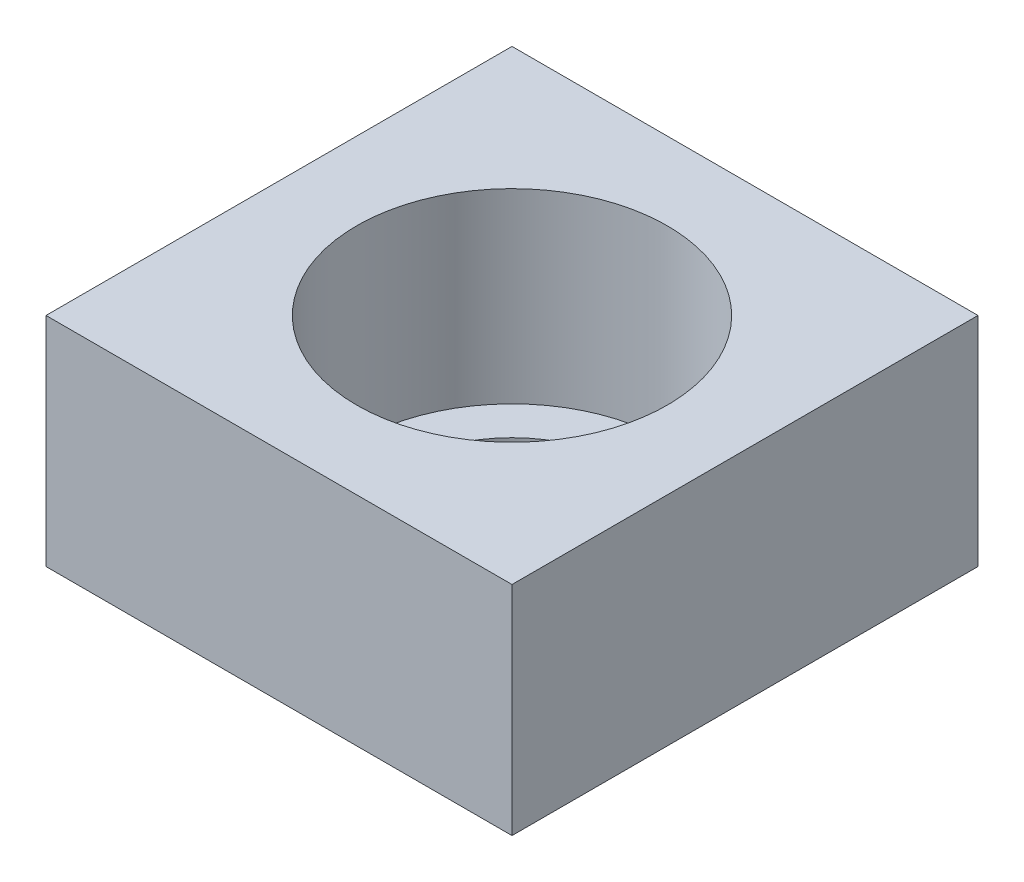
ISO-10303-21;
HEADER;
FILE_DESCRIPTION(('STEP AP214'),'2;1');
FILE_NAME('part.step','',(''),(''),'','','');
FILE_SCHEMA(('AUTOMOTIVE_DESIGN { 1 0 10303 214 1 1 1 1 }'));
ENDSEC;
DATA;
#1=APPLICATION_CONTEXT('core data for automotive mechanical design processes');
#2=APPLICATION_PROTOCOL_DEFINITION('international standard','automotive_design',2000,#1);
#3=PRODUCT_CONTEXT('',#1,'mechanical');
#4=PRODUCT('Part','Part','',(#3));
#5=PRODUCT_RELATED_PRODUCT_CATEGORY('part','',(#4));
#6=PRODUCT_DEFINITION_FORMATION('','',#4);
#7=PRODUCT_DEFINITION_CONTEXT('part definition',#1,'design');
#8=PRODUCT_DEFINITION('design','',#6,#7);
#9=PRODUCT_DEFINITION_SHAPE('','',#8);
#10=(LENGTH_UNIT() NAMED_UNIT(*) SI_UNIT(.MILLI.,.METRE.));
#11=(NAMED_UNIT(*) PLANE_ANGLE_UNIT() SI_UNIT($,.RADIAN.));
#12=(NAMED_UNIT(*) SI_UNIT($,.STERADIAN.) SOLID_ANGLE_UNIT());
#13=UNCERTAINTY_MEASURE_WITH_UNIT(LENGTH_MEASURE(1.E-05),#10,'distance_accuracy_value','');
#14=(GEOMETRIC_REPRESENTATION_CONTEXT(3) GLOBAL_UNCERTAINTY_ASSIGNED_CONTEXT((#13)) GLOBAL_UNIT_ASSIGNED_CONTEXT((#10,
#11,#12)) REPRESENTATION_CONTEXT('',''));
#15=CARTESIAN_POINT('',(0.,0.,0.));
#16=DIRECTION('',(0.,0.,1.));
#17=DIRECTION('',(1.,0.,0.));
#18=AXIS2_PLACEMENT_3D('',#15,#16,#17);
#19=CARTESIAN_POINT('',(0.,21.,0.));
#20=DIRECTION('',(0.,-1.,0.));
#21=DIRECTION('',(0.,0.,-1.));
#22=AXIS2_PLACEMENT_3D('',#19,#20,#21);
#23=CYLINDRICAL_SURFACE('',#22,11.);
#24=CARTESIAN_POINT('',(0.,0.,0.));
#25=DIRECTION('',(0.,1.,0.));
#26=DIRECTION('',(0.,0.,1.));
#27=AXIS2_PLACEMENT_3D('',#24,#25,#26);
#28=CIRCLE('',#27,11.);
#29=CARTESIAN_POINT('',(0.,0.,-11.));
#30=VERTEX_POINT('',#29);
#31=EDGE_CURVE('E102',#30,#30,#28,.T.);
#32=CARTESIAN_POINT('',(0.,3.,0.));
#33=DIRECTION('',(0.,1.,0.));
#34=DIRECTION('',(0.,0.,1.));
#35=AXIS2_PLACEMENT_3D('',#32,#33,#34);
#36=CIRCLE('',#35,11.);
#37=CARTESIAN_POINT('',(0.,3.,-11.));
#38=VERTEX_POINT('',#37);
#39=EDGE_CURVE('E37',#38,#38,#36,.T.);
#40=CARTESIAN_POINT('',(0.,0.,-11.));
#41=CARTESIAN_POINT('',(0.,0.03125,-11.));
#42=CARTESIAN_POINT('',(0.,0.0625000000000001,-11.));
#43=CARTESIAN_POINT('',(0.,0.125,-11.));
#44=CARTESIAN_POINT('',(0.,0.15625,-11.));
#45=CARTESIAN_POINT('',(0.,0.21875,-11.));
#46=CARTESIAN_POINT('',(0.,0.25,-11.));
#47=CARTESIAN_POINT('',(0.,0.3125,-11.));
#48=CARTESIAN_POINT('',(0.,0.34375,-11.));
#49=CARTESIAN_POINT('',(0.,0.40625,-11.));
#50=CARTESIAN_POINT('',(0.,0.4375,-11.));
#51=CARTESIAN_POINT('',(0.,0.5,-11.));
#52=CARTESIAN_POINT('',(0.,0.53125,-11.));
#53=CARTESIAN_POINT('',(0.,0.593750000000001,-11.));
#54=CARTESIAN_POINT('',(0.,0.625000000000001,-11.));
#55=CARTESIAN_POINT('',(0.,0.687500000000001,-11.));
#56=CARTESIAN_POINT('',(0.,0.718750000000001,-11.));
#57=CARTESIAN_POINT('',(0.,0.781250000000001,-11.));
#58=CARTESIAN_POINT('',(0.,0.812500000000001,-11.));
#59=CARTESIAN_POINT('',(0.,0.875000000000001,-11.));
#60=CARTESIAN_POINT('',(0.,0.906250000000001,-11.));
#61=CARTESIAN_POINT('',(0.,0.968750000000001,-11.));
#62=CARTESIAN_POINT('',(0.,1.,-11.));
#63=CARTESIAN_POINT('',(0.,1.0625,-11.));
#64=CARTESIAN_POINT('',(0.,1.09375,-11.));
#65=CARTESIAN_POINT('',(0.,1.15625,-11.));
#66=CARTESIAN_POINT('',(0.,1.1875,-11.));
#67=CARTESIAN_POINT('',(0.,1.25,-11.));
#68=CARTESIAN_POINT('',(0.,1.28125,-11.));
#69=CARTESIAN_POINT('',(0.,1.34375,-11.));
#70=CARTESIAN_POINT('',(0.,1.375,-11.));
#71=CARTESIAN_POINT('',(0.,1.4375,-11.));
#72=CARTESIAN_POINT('',(0.,1.46875,-11.));
#73=CARTESIAN_POINT('',(0.,1.53125,-11.));
#74=CARTESIAN_POINT('',(0.,1.5625,-11.));
#75=CARTESIAN_POINT('',(0.,1.625,-11.));
#76=CARTESIAN_POINT('',(0.,1.65625,-11.));
#77=CARTESIAN_POINT('',(0.,1.71875,-11.));
#78=CARTESIAN_POINT('',(0.,1.75,-11.));
#79=CARTESIAN_POINT('',(0.,1.8125,-11.));
#80=CARTESIAN_POINT('',(0.,1.84375,-11.));
#81=CARTESIAN_POINT('',(0.,1.90625,-11.));
#82=CARTESIAN_POINT('',(0.,1.9375,-11.));
#83=CARTESIAN_POINT('',(0.,2.,-11.));
#84=CARTESIAN_POINT('',(0.,2.03125,-11.));
#85=CARTESIAN_POINT('',(0.,2.09375,-11.));
#86=CARTESIAN_POINT('',(0.,2.125,-11.));
#87=CARTESIAN_POINT('',(0.,2.1875,-11.));
#88=CARTESIAN_POINT('',(0.,2.21875,-11.));
#89=CARTESIAN_POINT('',(0.,2.28125,-11.));
#90=CARTESIAN_POINT('',(0.,2.3125,-11.));
#91=CARTESIAN_POINT('',(0.,2.375,-11.));
#92=CARTESIAN_POINT('',(0.,2.40625,-11.));
#93=CARTESIAN_POINT('',(0.,2.46875,-11.));
#94=CARTESIAN_POINT('',(0.,2.5,-11.));
#95=CARTESIAN_POINT('',(0.,2.5625,-11.));
#96=CARTESIAN_POINT('',(0.,2.59375,-11.));
#97=CARTESIAN_POINT('',(0.,2.65625,-11.));
#98=CARTESIAN_POINT('',(0.,2.6875,-11.));
#99=CARTESIAN_POINT('',(0.,2.75,-11.));
#100=CARTESIAN_POINT('',(0.,2.78125,-11.));
#101=CARTESIAN_POINT('',(0.,2.84375,-11.));
#102=CARTESIAN_POINT('',(0.,2.875,-11.));
#103=CARTESIAN_POINT('',(0.,2.9375,-11.));
#104=CARTESIAN_POINT('',(0.,2.96875,-11.));
#105=CARTESIAN_POINT('',(0.,3.,-11.));
#106=B_SPLINE_CURVE_WITH_KNOTS('',3,(#40,#41,#42,#43,#44,#45,#46,#47,#48,#49,#50,#51,#52,#53,
#54,#55,#56,#57,#58,#59,#60,#61,#62,#63,#64,#65,#66,#67,#68,#69,#70,#71,#72,#73,#74,#75,#76,#77,
#78,#79,#80,#81,#82,#83,#84,#85,#86,#87,#88,#89,#90,#91,#92,#93,#94,#95,#96,#97,#98,#99,#100,
#101,#102,#103,#104,#105),.UNSPECIFIED.,.F.,.F.,(4,2,2,2,2,2,2,2,2,2,2,2,2,2,2,2,2,2,2,2,2,2,2,
2,2,2,2,2,2,2,2,2,4),(0.,0.0937500000000001,0.1875,0.28125,0.375,0.46875,0.5625,
0.656250000000001,0.750000000000001,0.843750000000001,0.937500000000001,1.03125,1.125,1.21875,
1.3125,1.40625,1.5,1.59375,1.6875,1.78125,1.875,1.96875,2.0625,2.15625,2.25,2.34375,2.4375,
2.53125,2.625,2.71875,2.8125,2.90625,3.),.UNSPECIFIED.);
#107=EDGE_CURVE('BSEAM33',#30,#38,#106,.T.);
#108=ORIENTED_EDGE('',*,*,#31,.F.);
#109=ORIENTED_EDGE('',*,*,#39,.T.);
#110=ORIENTED_EDGE('',*,*,#107,.T.);
#111=ORIENTED_EDGE('',*,*,#107,.F.);
#112=EDGE_LOOP('',(#108,#110,#109,#111));
#113=FACE_BOUND('',#112,.T.);
#114=ADVANCED_FACE('F33',(#113),#23,.F.);
#115=CARTESIAN_POINT('',(0.,21.,0.));
#116=DIRECTION('',(0.,1.,0.));
#117=DIRECTION('',(0.,0.,1.));
#118=AXIS2_PLACEMENT_3D('',#115,#116,#117);
#119=PLANE('',#118);
#120=CARTESIAN_POINT('',(0.,21.,0.));
#121=DIRECTION('',(0.,1.,0.));
#122=DIRECTION('',(0.,0.,1.));
#123=AXIS2_PLACEMENT_3D('',#120,#121,#122);
#124=CIRCLE('',#123,15.);
#125=CARTESIAN_POINT('',(0.,21.,15.));
#126=VERTEX_POINT('',#125);
#127=EDGE_CURVE('E116',#126,#126,#124,.T.);
#128=ORIENTED_EDGE('',*,*,#127,.F.);
#129=EDGE_LOOP('',(#128));
#130=FACE_BOUND('',#129,.T.);
#131=DIRECTION('',(0.,0.,-1.));
#132=VECTOR('',#131,1.);
#133=CARTESIAN_POINT('',(22.5,21.,-22.5));
#134=LINE('',#133,#132);
#135=CARTESIAN_POINT('',(22.5,21.,22.5));
#136=VERTEX_POINT('',#135);
#137=CARTESIAN_POINT('',(22.5,21.,-22.5));
#138=VERTEX_POINT('',#137);
#139=EDGE_CURVE('E86',#136,#138,#134,.T.);
#140=ORIENTED_EDGE('',*,*,#139,.T.);
#141=DIRECTION('',(-1.,0.,0.));
#142=VECTOR('',#141,1.);
#143=CARTESIAN_POINT('',(-22.5,21.,-22.5));
#144=LINE('',#143,#142);
#145=CARTESIAN_POINT('',(-22.5,21.,-22.5));
#146=VERTEX_POINT('',#145);
#147=EDGE_CURVE('E81',#138,#146,#144,.T.);
#148=ORIENTED_EDGE('',*,*,#147,.T.);
#149=DIRECTION('',(0.,0.,1.));
#150=VECTOR('',#149,1.);
#151=CARTESIAN_POINT('',(-22.5,21.,-22.5));
#152=LINE('',#151,#150);
#153=CARTESIAN_POINT('',(-22.5,21.,22.5));
#154=VERTEX_POINT('',#153);
#155=EDGE_CURVE('E84',#146,#154,#152,.T.);
#156=ORIENTED_EDGE('',*,*,#155,.T.);
#157=DIRECTION('',(1.,0.,0.));
#158=VECTOR('',#157,1.);
#159=CARTESIAN_POINT('',(-22.5,21.,22.5));
#160=LINE('',#159,#158);
#161=EDGE_CURVE('E51',#154,#136,#160,.T.);
#162=ORIENTED_EDGE('',*,*,#161,.T.);
#163=EDGE_LOOP('',(#140,#148,#156,#162));
#164=FACE_BOUND('',#163,.T.);
#165=ADVANCED_FACE('F82',(#130,#164),#119,.T.);
#166=CARTESIAN_POINT('',(0.,0.,0.));
#167=DIRECTION('',(0.,1.,0.));
#168=DIRECTION('',(0.,0.,1.));
#169=AXIS2_PLACEMENT_3D('',#166,#167,#168);
#170=PLANE('',#169);
#171=DIRECTION('',(0.,0.,-1.));
#172=VECTOR('',#171,1.);
#173=CARTESIAN_POINT('',(22.5,0.,-22.5));
#174=LINE('',#173,#172);
#175=CARTESIAN_POINT('',(22.5,0.,22.5));
#176=VERTEX_POINT('',#175);
#177=CARTESIAN_POINT('',(22.5,0.,-22.5));
#178=VERTEX_POINT('',#177);
#179=EDGE_CURVE('E99',#176,#178,#174,.T.);
#180=ORIENTED_EDGE('',*,*,#179,.F.);
#181=DIRECTION('',(1.,0.,0.));
#182=VECTOR('',#181,1.);
#183=CARTESIAN_POINT('',(-22.5,0.,22.5));
#184=LINE('',#183,#182);
#185=CARTESIAN_POINT('',(-22.5,0.,22.5));
#186=VERTEX_POINT('',#185);
#187=EDGE_CURVE('E74',#186,#176,#184,.T.);
#188=ORIENTED_EDGE('',*,*,#187,.F.);
#189=DIRECTION('',(0.,0.,1.));
#190=VECTOR('',#189,1.);
#191=CARTESIAN_POINT('',(-22.5,0.,-22.5));
#192=LINE('',#191,#190);
#193=CARTESIAN_POINT('',(-22.5,0.,-22.5));
#194=VERTEX_POINT('',#193);
#195=EDGE_CURVE('E68',#194,#186,#192,.T.);
#196=ORIENTED_EDGE('',*,*,#195,.F.);
#197=DIRECTION('',(-1.,0.,0.));
#198=VECTOR('',#197,1.);
#199=CARTESIAN_POINT('',(-22.5,0.,-22.5));
#200=LINE('',#199,#198);
#201=EDGE_CURVE('E90',#178,#194,#200,.T.);
#202=ORIENTED_EDGE('',*,*,#201,.F.);
#203=EDGE_LOOP('',(#180,#188,#196,#202));
#204=FACE_BOUND('',#203,.T.);
#205=ORIENTED_EDGE('',*,*,#31,.T.);
#206=EDGE_LOOP('',(#205));
#207=FACE_BOUND('',#206,.T.);
#208=ADVANCED_FACE('F110',(#204,#207),#170,.F.);
#209=CARTESIAN_POINT('',(22.5,21.,-22.5));
#210=DIRECTION('',(-1.,0.,0.));
#211=DIRECTION('',(0.,0.,1.));
#212=AXIS2_PLACEMENT_3D('',#209,#210,#211);
#213=PLANE('',#212);
#214=ORIENTED_EDGE('',*,*,#179,.T.);
#215=DIRECTION('',(0.,-1.,0.));
#216=VECTOR('',#215,1.);
#217=CARTESIAN_POINT('',(22.5,21.,-22.5));
#218=LINE('',#217,#216);
#219=EDGE_CURVE('E11',#138,#178,#218,.T.);
#220=ORIENTED_EDGE('',*,*,#219,.F.);
#221=ORIENTED_EDGE('',*,*,#139,.F.);
#222=DIRECTION('',(0.,-1.,0.));
#223=VECTOR('',#222,1.);
#224=CARTESIAN_POINT('',(22.5,21.,22.5));
#225=LINE('',#224,#223);
#226=EDGE_CURVE('E95',#136,#176,#225,.T.);
#227=ORIENTED_EDGE('',*,*,#226,.T.);
#228=EDGE_LOOP('',(#214,#220,#221,#227));
#229=FACE_BOUND('',#228,.T.);
#230=ADVANCED_FACE('F35',(#229),#213,.F.);
#231=CARTESIAN_POINT('',(-22.5,21.,-22.5));
#232=DIRECTION('',(0.,0.,1.));
#233=DIRECTION('',(1.,0.,0.));
#234=AXIS2_PLACEMENT_3D('',#231,#232,#233);
#235=PLANE('',#234);
#236=ORIENTED_EDGE('',*,*,#201,.T.);
#237=DIRECTION('',(0.,-1.,0.));
#238=VECTOR('',#237,1.);
#239=CARTESIAN_POINT('',(-22.5,21.,-22.5));
#240=LINE('',#239,#238);
#241=EDGE_CURVE('E43',#146,#194,#240,.T.);
#242=ORIENTED_EDGE('',*,*,#241,.F.);
#243=ORIENTED_EDGE('',*,*,#147,.F.);
#244=ORIENTED_EDGE('',*,*,#219,.T.);
#245=EDGE_LOOP('',(#236,#242,#243,#244));
#246=FACE_BOUND('',#245,.T.);
#247=ADVANCED_FACE('F89',(#246),#235,.F.);
#248=CARTESIAN_POINT('',(-22.5,21.,-22.5));
#249=DIRECTION('',(1.,0.,0.));
#250=DIRECTION('',(0.,0.,-1.));
#251=AXIS2_PLACEMENT_3D('',#248,#249,#250);
#252=PLANE('',#251);
#253=ORIENTED_EDGE('',*,*,#195,.T.);
#254=DIRECTION('',(0.,-1.,0.));
#255=VECTOR('',#254,1.);
#256=CARTESIAN_POINT('',(-22.5,21.,22.5));
#257=LINE('',#256,#255);
#258=EDGE_CURVE('E91',#154,#186,#257,.T.);
#259=ORIENTED_EDGE('',*,*,#258,.F.);
#260=ORIENTED_EDGE('',*,*,#155,.F.);
#261=ORIENTED_EDGE('',*,*,#241,.T.);
#262=EDGE_LOOP('',(#253,#259,#260,#261));
#263=FACE_BOUND('',#262,.T.);
#264=ADVANCED_FACE('F93',(#263),#252,.F.);
#265=CARTESIAN_POINT('',(-22.5,21.,22.5));
#266=DIRECTION('',(0.,0.,-1.));
#267=DIRECTION('',(-1.,0.,0.));
#268=AXIS2_PLACEMENT_3D('',#265,#266,#267);
#269=PLANE('',#268);
#270=ORIENTED_EDGE('',*,*,#187,.T.);
#271=ORIENTED_EDGE('',*,*,#226,.F.);
#272=ORIENTED_EDGE('',*,*,#161,.F.);
#273=ORIENTED_EDGE('',*,*,#258,.T.);
#274=EDGE_LOOP('',(#270,#271,#272,#273));
#275=FACE_BOUND('',#274,.T.);
#276=ADVANCED_FACE('F107',(#275),#269,.F.);
#277=CARTESIAN_POINT('',(0.,3.,0.));
#278=DIRECTION('',(0.,1.,0.));
#279=DIRECTION('',(0.,0.,1.));
#280=AXIS2_PLACEMENT_3D('',#277,#278,#279);
#281=CYLINDRICAL_SURFACE('',#280,15.);
#282=CARTESIAN_POINT('',(0.,3.,0.));
#283=DIRECTION('',(0.,1.,0.));
#284=DIRECTION('',(0.,0.,1.));
#285=AXIS2_PLACEMENT_3D('',#282,#283,#284);
#286=CIRCLE('',#285,15.);
#287=CARTESIAN_POINT('',(0.,3.,15.));
#288=VERTEX_POINT('',#287);
#289=EDGE_CURVE('E119',#288,#288,#286,.T.);
#290=ORIENTED_EDGE('',*,*,#289,.F.);
#291=EDGE_LOOP('',(#290));
#292=FACE_BOUND('',#291,.T.);
#293=ORIENTED_EDGE('',*,*,#127,.T.);
#294=EDGE_LOOP('',(#293));
#295=FACE_BOUND('',#294,.T.);
#296=ADVANCED_FACE('F129',(#292,#295),#281,.F.);
#297=CARTESIAN_POINT('',(0.,3.,0.));
#298=DIRECTION('',(0.,1.,0.));
#299=DIRECTION('',(0.,0.,1.));
#300=AXIS2_PLACEMENT_3D('',#297,#298,#299);
#301=PLANE('',#300);
#302=ORIENTED_EDGE('',*,*,#39,.F.);
#303=EDGE_LOOP('',(#302));
#304=FACE_BOUND('',#303,.T.);
#305=ORIENTED_EDGE('',*,*,#289,.T.);
#306=EDGE_LOOP('',(#305));
#307=FACE_BOUND('',#306,.T.);
#308=ADVANCED_FACE('F127',(#304,#307),#301,.T.);
#309=CLOSED_SHELL('',(#114,#165,#208,#230,#247,#264,#276,#296,#308));
#310=MANIFOLD_SOLID_BREP('B2',#309);
#311=ADVANCED_BREP_SHAPE_REPRESENTATION('',(#18,#310),#14);
#312=SHAPE_DEFINITION_REPRESENTATION(#9,#311);
ENDSEC;
END-ISO-10303-21;
